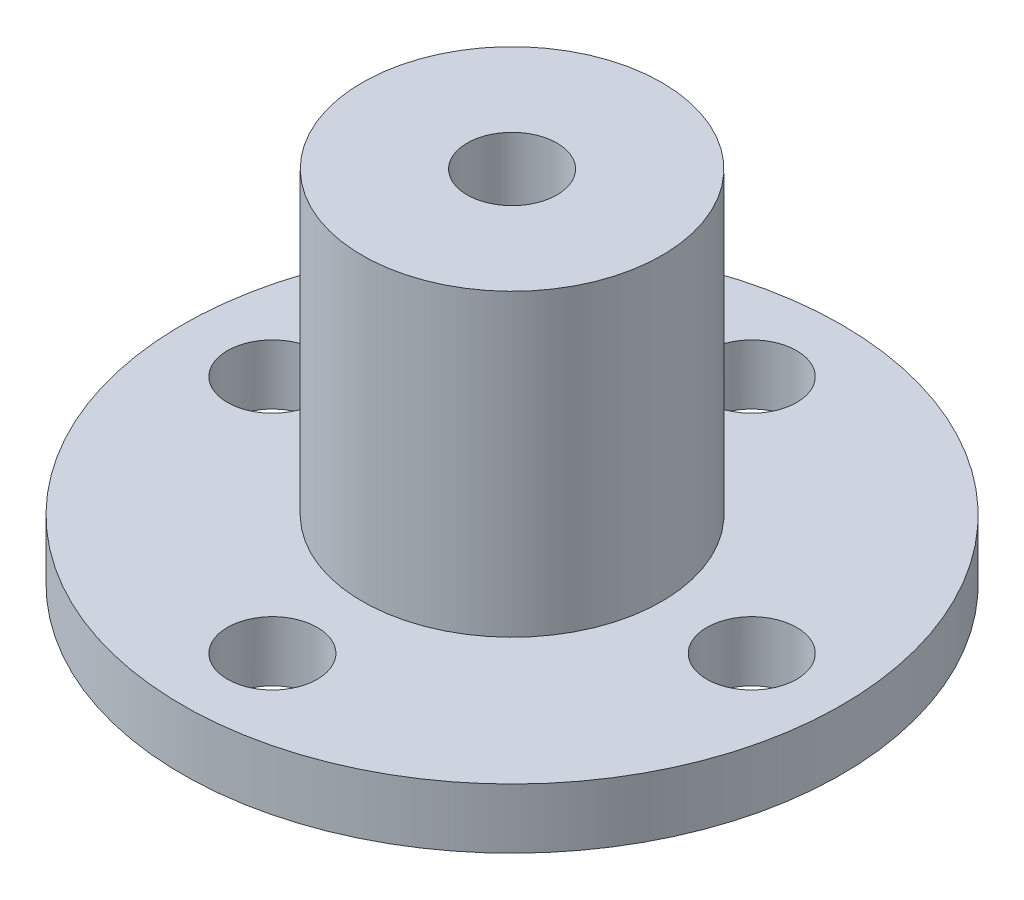
ISO-10303-21;
HEADER;
FILE_DESCRIPTION(('STEP AP214'),'2;1');
FILE_NAME('part.step','',(''),(''),'','','');
FILE_SCHEMA(('AUTOMOTIVE_DESIGN { 1 0 10303 214 1 1 1 1 }'));
ENDSEC;
DATA;
#1=APPLICATION_CONTEXT('core data for automotive mechanical design processes');
#2=APPLICATION_PROTOCOL_DEFINITION('international standard','automotive_design',2000,#1);
#3=PRODUCT_CONTEXT('',#1,'mechanical');
#4=PRODUCT('Part','Part','',(#3));
#5=PRODUCT_RELATED_PRODUCT_CATEGORY('part','',(#4));
#6=PRODUCT_DEFINITION_FORMATION('','',#4);
#7=PRODUCT_DEFINITION_CONTEXT('part definition',#1,'design');
#8=PRODUCT_DEFINITION('design','',#6,#7);
#9=PRODUCT_DEFINITION_SHAPE('','',#8);
#10=(LENGTH_UNIT() NAMED_UNIT(*) SI_UNIT(.MILLI.,.METRE.));
#11=(NAMED_UNIT(*) PLANE_ANGLE_UNIT() SI_UNIT($,.RADIAN.));
#12=(NAMED_UNIT(*) SI_UNIT($,.STERADIAN.) SOLID_ANGLE_UNIT());
#13=UNCERTAINTY_MEASURE_WITH_UNIT(LENGTH_MEASURE(1.E-05),#10,'distance_accuracy_value','');
#14=(GEOMETRIC_REPRESENTATION_CONTEXT(3) GLOBAL_UNCERTAINTY_ASSIGNED_CONTEXT((#13)) GLOBAL_UNIT_ASSIGNED_CONTEXT((#10,
#11,#12)) REPRESENTATION_CONTEXT('',''));
#15=CARTESIAN_POINT('',(0.,0.,0.));
#16=DIRECTION('',(0.,0.,1.));
#17=DIRECTION('',(1.,0.,0.));
#18=AXIS2_PLACEMENT_3D('',#15,#16,#17);
#19=CARTESIAN_POINT('',(0.,0.,0.));
#20=DIRECTION('',(0.,-1.,0.));
#21=DIRECTION('',(0.,0.,-1.));
#22=AXIS2_PLACEMENT_3D('',#19,#20,#21);
#23=PLANE('',#22);
#24=CARTESIAN_POINT('',(-8.,0.,0.));
#25=DIRECTION('',(0.,-1.,0.));
#26=DIRECTION('',(0.,0.,-1.));
#27=AXIS2_PLACEMENT_3D('',#24,#25,#26);
#28=CIRCLE('',#27,1.5);
#29=CARTESIAN_POINT('',(-8.,0.,-1.5));
#30=VERTEX_POINT('',#29);
#31=EDGE_CURVE('E62',#30,#30,#28,.T.);
#32=ORIENTED_EDGE('',*,*,#31,.F.);
#33=EDGE_LOOP('',(#32));
#34=FACE_BOUND('',#33,.T.);
#35=CARTESIAN_POINT('',(0.,0.,8.));
#36=DIRECTION('',(0.,-1.,0.));
#37=DIRECTION('',(0.,0.,-1.));
#38=AXIS2_PLACEMENT_3D('',#35,#36,#37);
#39=CIRCLE('',#38,1.5);
#40=CARTESIAN_POINT('',(0.,0.,6.5));
#41=VERTEX_POINT('',#40);
#42=EDGE_CURVE('E122',#41,#41,#39,.T.);
#43=ORIENTED_EDGE('',*,*,#42,.F.);
#44=EDGE_LOOP('',(#43));
#45=FACE_BOUND('',#44,.T.);
#46=CARTESIAN_POINT('',(8.,0.,0.));
#47=DIRECTION('',(0.,-1.,0.));
#48=DIRECTION('',(0.,0.,-1.));
#49=AXIS2_PLACEMENT_3D('',#46,#47,#48);
#50=CIRCLE('',#49,1.5);
#51=CARTESIAN_POINT('',(8.,0.,-1.50000000000006));
#52=VERTEX_POINT('',#51);
#53=EDGE_CURVE('E126',#52,#52,#50,.T.);
#54=ORIENTED_EDGE('',*,*,#53,.F.);
#55=EDGE_LOOP('',(#54));
#56=FACE_BOUND('',#55,.T.);
#57=CARTESIAN_POINT('',(0.,0.,-8.));
#58=DIRECTION('',(0.,-1.,0.));
#59=DIRECTION('',(0.,0.,-1.));
#60=AXIS2_PLACEMENT_3D('',#57,#58,#59);
#61=CIRCLE('',#60,1.5);
#62=CARTESIAN_POINT('',(0.,0.,-9.5));
#63=VERTEX_POINT('',#62);
#64=EDGE_CURVE('E130',#63,#63,#61,.T.);
#65=ORIENTED_EDGE('',*,*,#64,.F.);
#66=EDGE_LOOP('',(#65));
#67=FACE_BOUND('',#66,.T.);
#68=CARTESIAN_POINT('',(0.,0.,0.));
#69=DIRECTION('',(0.,-1.,0.));
#70=DIRECTION('',(0.,0.,-1.));
#71=AXIS2_PLACEMENT_3D('',#68,#69,#70);
#72=CIRCLE('',#71,1.5);
#73=CARTESIAN_POINT('',(0.,0.,-1.5));
#74=VERTEX_POINT('',#73);
#75=EDGE_CURVE('E72',#74,#74,#72,.T.);
#76=ORIENTED_EDGE('',*,*,#75,.F.);
#77=EDGE_LOOP('',(#76));
#78=FACE_BOUND('',#77,.T.);
#79=CARTESIAN_POINT('',(0.,0.,0.));
#80=DIRECTION('',(0.,-1.,0.));
#81=DIRECTION('',(0.,0.,-1.));
#82=AXIS2_PLACEMENT_3D('',#79,#80,#81);
#83=CIRCLE('',#82,11.);
#84=CARTESIAN_POINT('',(0.,0.,-11.));
#85=VERTEX_POINT('',#84);
#86=EDGE_CURVE('E83',#85,#85,#83,.T.);
#87=ORIENTED_EDGE('',*,*,#86,.T.);
#88=EDGE_LOOP('',(#87));
#89=FACE_BOUND('',#88,.T.);
#90=ADVANCED_FACE('F39',(#34,#45,#56,#67,#78,#89),#23,.T.);
#91=CARTESIAN_POINT('',(0.,12.,0.));
#92=DIRECTION('',(0.,1.,0.));
#93=DIRECTION('',(0.,0.,1.));
#94=AXIS2_PLACEMENT_3D('',#91,#92,#93);
#95=PLANE('',#94);
#96=CARTESIAN_POINT('',(0.,12.,0.));
#97=DIRECTION('',(0.,-1.,0.));
#98=DIRECTION('',(0.,0.,-1.));
#99=AXIS2_PLACEMENT_3D('',#96,#97,#98);
#100=CIRCLE('',#99,1.5);
#101=CARTESIAN_POINT('',(0.,12.,-1.5));
#102=VERTEX_POINT('',#101);
#103=EDGE_CURVE('E77',#102,#102,#100,.T.);
#104=ORIENTED_EDGE('',*,*,#103,.T.);
#105=EDGE_LOOP('',(#104));
#106=FACE_BOUND('',#105,.T.);
#107=CARTESIAN_POINT('',(0.,12.,0.));
#108=DIRECTION('',(0.,-1.,0.));
#109=DIRECTION('',(0.,0.,-1.));
#110=AXIS2_PLACEMENT_3D('',#107,#108,#109);
#111=CIRCLE('',#110,5.);
#112=CARTESIAN_POINT('',(0.,12.,-5.));
#113=VERTEX_POINT('',#112);
#114=EDGE_CURVE('E10',#113,#113,#111,.T.);
#115=ORIENTED_EDGE('',*,*,#114,.F.);
#116=EDGE_LOOP('',(#115));
#117=FACE_BOUND('',#116,.T.);
#118=ADVANCED_FACE('F107',(#106,#117),#95,.T.);
#119=CARTESIAN_POINT('',(0.,0.,0.));
#120=DIRECTION('',(0.,-1.,0.));
#121=DIRECTION('',(0.,0.,-1.));
#122=AXIS2_PLACEMENT_3D('',#119,#120,#121);
#123=CYLINDRICAL_SURFACE('',#122,5.);
#124=ORIENTED_EDGE('',*,*,#114,.T.);
#125=EDGE_LOOP('',(#124));
#126=FACE_BOUND('',#125,.T.);
#127=CARTESIAN_POINT('',(0.,2.,0.));
#128=DIRECTION('',(0.,-1.,0.));
#129=DIRECTION('',(0.,0.,-1.));
#130=AXIS2_PLACEMENT_3D('',#127,#128,#129);
#131=CIRCLE('',#130,5.);
#132=CARTESIAN_POINT('',(0.,2.,-5.));
#133=VERTEX_POINT('',#132);
#134=EDGE_CURVE('E47',#133,#133,#131,.T.);
#135=ORIENTED_EDGE('',*,*,#134,.F.);
#136=EDGE_LOOP('',(#135));
#137=FACE_BOUND('',#136,.T.);
#138=ADVANCED_FACE('F98',(#126,#137),#123,.T.);
#139=CARTESIAN_POINT('',(5.,2.,0.));
#140=DIRECTION('',(0.,1.,0.));
#141=DIRECTION('',(0.,0.,1.));
#142=AXIS2_PLACEMENT_3D('',#139,#140,#141);
#143=PLANE('',#142);
#144=CARTESIAN_POINT('',(-8.,2.,0.));
#145=DIRECTION('',(0.,1.,0.));
#146=DIRECTION('',(0.,0.,1.));
#147=AXIS2_PLACEMENT_3D('',#144,#145,#146);
#148=CIRCLE('',#147,1.5);
#149=CARTESIAN_POINT('',(-8.,2.,1.5));
#150=VERTEX_POINT('',#149);
#151=EDGE_CURVE('E42',#150,#150,#148,.T.);
#152=ORIENTED_EDGE('',*,*,#151,.F.);
#153=EDGE_LOOP('',(#152));
#154=FACE_BOUND('',#153,.T.);
#155=CARTESIAN_POINT('',(0.,2.,8.));
#156=DIRECTION('',(0.,1.,0.));
#157=DIRECTION('',(0.,0.,1.));
#158=AXIS2_PLACEMENT_3D('',#155,#156,#157);
#159=CIRCLE('',#158,1.5);
#160=CARTESIAN_POINT('',(0.,2.,9.5));
#161=VERTEX_POINT('',#160);
#162=EDGE_CURVE('E65',#161,#161,#159,.T.);
#163=ORIENTED_EDGE('',*,*,#162,.F.);
#164=EDGE_LOOP('',(#163));
#165=FACE_BOUND('',#164,.T.);
#166=CARTESIAN_POINT('',(8.,2.,0.));
#167=DIRECTION('',(0.,1.,0.));
#168=DIRECTION('',(0.,0.,1.));
#169=AXIS2_PLACEMENT_3D('',#166,#167,#168);
#170=CIRCLE('',#169,1.5);
#171=CARTESIAN_POINT('',(8.,2.,1.49999999999994));
#172=VERTEX_POINT('',#171);
#173=EDGE_CURVE('E61',#172,#172,#170,.T.);
#174=ORIENTED_EDGE('',*,*,#173,.F.);
#175=EDGE_LOOP('',(#174));
#176=FACE_BOUND('',#175,.T.);
#177=CARTESIAN_POINT('',(0.,2.,-8.));
#178=DIRECTION('',(0.,1.,0.));
#179=DIRECTION('',(0.,0.,1.));
#180=AXIS2_PLACEMENT_3D('',#177,#178,#179);
#181=CIRCLE('',#180,1.5);
#182=CARTESIAN_POINT('',(0.,2.,-6.5));
#183=VERTEX_POINT('',#182);
#184=EDGE_CURVE('E57',#183,#183,#181,.T.);
#185=ORIENTED_EDGE('',*,*,#184,.F.);
#186=EDGE_LOOP('',(#185));
#187=FACE_BOUND('',#186,.T.);
#188=ORIENTED_EDGE('',*,*,#134,.T.);
#189=EDGE_LOOP('',(#188));
#190=FACE_BOUND('',#189,.T.);
#191=CARTESIAN_POINT('',(0.,2.,0.));
#192=DIRECTION('',(0.,-1.,0.));
#193=DIRECTION('',(0.,0.,-1.));
#194=AXIS2_PLACEMENT_3D('',#191,#192,#193);
#195=CIRCLE('',#194,11.);
#196=CARTESIAN_POINT('',(0.,2.,-11.));
#197=VERTEX_POINT('',#196);
#198=EDGE_CURVE('E53',#197,#197,#195,.T.);
#199=ORIENTED_EDGE('',*,*,#198,.F.);
#200=EDGE_LOOP('',(#199));
#201=FACE_BOUND('',#200,.T.);
#202=ADVANCED_FACE('F96',(#154,#165,#176,#187,#190,#201),#143,.T.);
#203=CARTESIAN_POINT('',(0.,0.,0.));
#204=DIRECTION('',(0.,-1.,0.));
#205=DIRECTION('',(0.,0.,-1.));
#206=AXIS2_PLACEMENT_3D('',#203,#204,#205);
#207=CYLINDRICAL_SURFACE('',#206,11.);
#208=ORIENTED_EDGE('',*,*,#198,.T.);
#209=EDGE_LOOP('',(#208));
#210=FACE_BOUND('',#209,.T.);
#211=ORIENTED_EDGE('',*,*,#86,.F.);
#212=EDGE_LOOP('',(#211));
#213=FACE_BOUND('',#212,.T.);
#214=ADVANCED_FACE('F93',(#210,#213),#207,.T.);
#215=CARTESIAN_POINT('',(0.,12.,0.));
#216=DIRECTION('',(0.,-1.,0.));
#217=DIRECTION('',(0.,0.,-1.));
#218=AXIS2_PLACEMENT_3D('',#215,#216,#217);
#219=CYLINDRICAL_SURFACE('',#218,1.5);
#220=ORIENTED_EDGE('',*,*,#103,.F.);
#221=EDGE_LOOP('',(#220));
#222=FACE_BOUND('',#221,.T.);
#223=ORIENTED_EDGE('',*,*,#75,.T.);
#224=EDGE_LOOP('',(#223));
#225=FACE_BOUND('',#224,.T.);
#226=ADVANCED_FACE('F105',(#222,#225),#219,.F.);
#227=CARTESIAN_POINT('',(0.,12.,-8.));
#228=DIRECTION('',(0.,-1.,0.));
#229=DIRECTION('',(0.,0.,-1.));
#230=AXIS2_PLACEMENT_3D('',#227,#228,#229);
#231=CYLINDRICAL_SURFACE('',#230,1.5);
#232=ORIENTED_EDGE('',*,*,#184,.T.);
#233=EDGE_LOOP('',(#232));
#234=FACE_BOUND('',#233,.T.);
#235=ORIENTED_EDGE('',*,*,#64,.T.);
#236=EDGE_LOOP('',(#235));
#237=FACE_BOUND('',#236,.T.);
#238=ADVANCED_FACE('F154',(#234,#237),#231,.F.);
#239=CARTESIAN_POINT('',(8.,12.,0.));
#240=DIRECTION('',(0.,-1.,0.));
#241=DIRECTION('',(0.,0.,-1.));
#242=AXIS2_PLACEMENT_3D('',#239,#240,#241);
#243=CYLINDRICAL_SURFACE('',#242,1.5);
#244=ORIENTED_EDGE('',*,*,#173,.T.);
#245=EDGE_LOOP('',(#244));
#246=FACE_BOUND('',#245,.T.);
#247=ORIENTED_EDGE('',*,*,#53,.T.);
#248=EDGE_LOOP('',(#247));
#249=FACE_BOUND('',#248,.T.);
#250=ADVANCED_FACE('F149',(#246,#249),#243,.F.);
#251=CARTESIAN_POINT('',(0.,12.,8.));
#252=DIRECTION('',(0.,-1.,0.));
#253=DIRECTION('',(0.,0.,-1.));
#254=AXIS2_PLACEMENT_3D('',#251,#252,#253);
#255=CYLINDRICAL_SURFACE('',#254,1.5);
#256=ORIENTED_EDGE('',*,*,#162,.T.);
#257=EDGE_LOOP('',(#256));
#258=FACE_BOUND('',#257,.T.);
#259=ORIENTED_EDGE('',*,*,#42,.T.);
#260=EDGE_LOOP('',(#259));
#261=FACE_BOUND('',#260,.T.);
#262=ADVANCED_FACE('F144',(#258,#261),#255,.F.);
#263=CARTESIAN_POINT('',(-8.,12.,0.));
#264=DIRECTION('',(0.,-1.,0.));
#265=DIRECTION('',(0.,0.,-1.));
#266=AXIS2_PLACEMENT_3D('',#263,#264,#265);
#267=CYLINDRICAL_SURFACE('',#266,1.5);
#268=ORIENTED_EDGE('',*,*,#151,.T.);
#269=EDGE_LOOP('',(#268));
#270=FACE_BOUND('',#269,.T.);
#271=ORIENTED_EDGE('',*,*,#31,.T.);
#272=EDGE_LOOP('',(#271));
#273=FACE_BOUND('',#272,.T.);
#274=ADVANCED_FACE('F142',(#270,#273),#267,.F.);
#275=CLOSED_SHELL('',(#90,#118,#138,#202,#214,#226,#238,#250,#262,#274));
#276=MANIFOLD_SOLID_BREP('B2',#275);
#277=ADVANCED_BREP_SHAPE_REPRESENTATION('',(#18,#276),#14);
#278=SHAPE_DEFINITION_REPRESENTATION(#9,#277);
ENDSEC;
END-ISO-10303-21;
